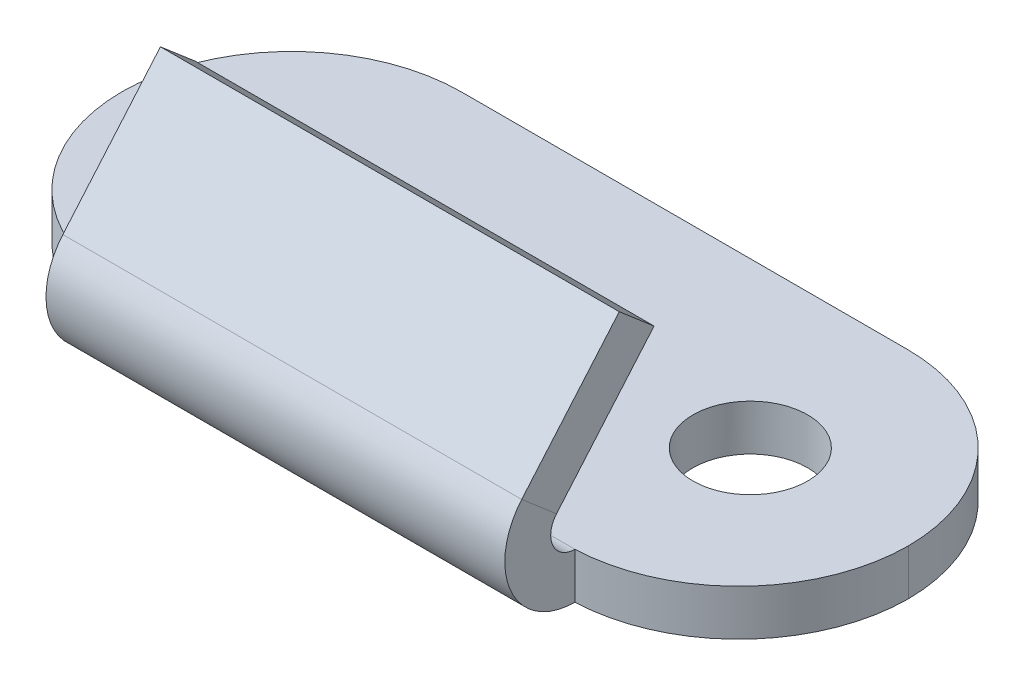
ISO-10303-21;
HEADER;
FILE_DESCRIPTION(('STEP AP214'),'2;1');
FILE_NAME('part.step','',(''),(''),'','','');
FILE_SCHEMA(('AUTOMOTIVE_DESIGN { 1 0 10303 214 1 1 1 1 }'));
ENDSEC;
DATA;
#1=APPLICATION_CONTEXT('core data for automotive mechanical design processes');
#2=APPLICATION_PROTOCOL_DEFINITION('international standard','automotive_design',2000,#1);
#3=PRODUCT_CONTEXT('',#1,'mechanical');
#4=PRODUCT('Part','Part','',(#3));
#5=PRODUCT_RELATED_PRODUCT_CATEGORY('part','',(#4));
#6=PRODUCT_DEFINITION_FORMATION('','',#4);
#7=PRODUCT_DEFINITION_CONTEXT('part definition',#1,'design');
#8=PRODUCT_DEFINITION('design','',#6,#7);
#9=PRODUCT_DEFINITION_SHAPE('','',#8);
#10=(LENGTH_UNIT() NAMED_UNIT(*) SI_UNIT(.MILLI.,.METRE.));
#11=(NAMED_UNIT(*) PLANE_ANGLE_UNIT() SI_UNIT($,.RADIAN.));
#12=(NAMED_UNIT(*) SI_UNIT($,.STERADIAN.) SOLID_ANGLE_UNIT());
#13=UNCERTAINTY_MEASURE_WITH_UNIT(LENGTH_MEASURE(1.E-05),#10,'distance_accuracy_value','');
#14=(GEOMETRIC_REPRESENTATION_CONTEXT(3) GLOBAL_UNCERTAINTY_ASSIGNED_CONTEXT((#13)) GLOBAL_UNIT_ASSIGNED_CONTEXT((#10,
#11,#12)) REPRESENTATION_CONTEXT('',''));
#15=CARTESIAN_POINT('',(0.,0.,0.));
#16=DIRECTION('',(0.,0.,1.));
#17=DIRECTION('',(1.,0.,0.));
#18=AXIS2_PLACEMENT_3D('',#15,#16,#17);
#19=CARTESIAN_POINT('',(12.,-0.911107922838355,13.9370407566886));
#20=DIRECTION('',(0.,0.650791373455968,0.759256602365296));
#21=DIRECTION('',(0.,-0.759256602365297,0.650791373455968));
#22=AXIS2_PLACEMENT_3D('',#19,#20,#21);
#23=PLANE('',#22);
#24=DIRECTION('',(0.,-0.759256602365297,0.650791373455969));
#25=VECTOR('',#24,1.);
#26=CARTESIAN_POINT('',(7.,-0.911107922838355,13.9370407566886));
#27=LINE('',#26,#25);
#28=CARTESIAN_POINT('',(7.,6.08889207716165,7.93704075668858));
#29=VERTEX_POINT('',#28);
#30=CARTESIAN_POINT('',(7.,2.61597292568767,10.9138286008091));
#31=VERTEX_POINT('',#30);
#32=EDGE_CURVE('E187',#29,#31,#27,.T.);
#33=ORIENTED_EDGE('',*,*,#32,.T.);
#34=DIRECTION('',(-1.,0.,0.));
#35=VECTOR('',#34,1.);
#36=CARTESIAN_POINT('',(12.,2.61597292568767,10.9138286008091));
#37=LINE('',#36,#35);
#38=CARTESIAN_POINT('',(-7.,2.61597292568767,10.9138286008091));
#39=VERTEX_POINT('',#38);
#40=EDGE_CURVE('E196',#31,#39,#37,.T.);
#41=ORIENTED_EDGE('',*,*,#40,.T.);
#42=DIRECTION('',(0.,-0.759256602365297,0.650791373455969));
#43=VECTOR('',#42,1.);
#44=CARTESIAN_POINT('',(-7.,-0.911107922838355,13.9370407566886));
#45=LINE('',#44,#43);
#46=CARTESIAN_POINT('',(-7.,6.08889207716165,7.93704075668858));
#47=VERTEX_POINT('',#46);
#48=EDGE_CURVE('E154',#47,#39,#45,.T.);
#49=ORIENTED_EDGE('',*,*,#48,.F.);
#50=DIRECTION('',(-1.,0.,0.));
#51=VECTOR('',#50,1.);
#52=CARTESIAN_POINT('',(12.,6.08889207716165,7.93704075668858));
#53=LINE('',#52,#51);
#54=EDGE_CURVE('E208',#29,#47,#53,.T.);
#55=ORIENTED_EDGE('',*,*,#54,.F.);
#56=EDGE_LOOP('',(#33,#41,#49,#55));
#57=FACE_BOUND('',#56,.T.);
#58=ADVANCED_FACE('F34',(#57),#23,.F.);
#59=CARTESIAN_POINT('',(12.,7.,9.));
#60=DIRECTION('',(0.,0.759256602365296,-0.650791373455968));
#61=DIRECTION('',(0.,0.650791373455968,0.759256602365297));
#62=AXIS2_PLACEMENT_3D('',#59,#60,#61);
#63=PLANE('',#62);
#64=DIRECTION('',(-1.,0.,0.));
#65=VECTOR('',#64,1.);
#66=CARTESIAN_POINT('',(12.,7.,9.));
#67=LINE('',#66,#65);
#68=CARTESIAN_POINT('',(7.,7.,9.));
#69=VERTEX_POINT('',#68);
#70=CARTESIAN_POINT('',(-7.,7.,9.));
#71=VERTEX_POINT('',#70);
#72=EDGE_CURVE('E206',#69,#71,#67,.T.);
#73=ORIENTED_EDGE('',*,*,#72,.F.);
#74=DIRECTION('',(0.,0.650791373455969,0.759256602365297));
#75=VECTOR('',#74,1.);
#76=CARTESIAN_POINT('',(7.,7.,9.));
#77=LINE('',#76,#75);
#78=EDGE_CURVE('E190',#69,#29,#77,.F.);
#79=ORIENTED_EDGE('',*,*,#78,.T.);
#80=ORIENTED_EDGE('',*,*,#54,.T.);
#81=DIRECTION('',(0.,0.650791373455969,0.759256602365297));
#82=VECTOR('',#81,1.);
#83=CARTESIAN_POINT('',(-7.,7.,9.));
#84=LINE('',#83,#82);
#85=EDGE_CURVE('E157',#71,#47,#84,.F.);
#86=ORIENTED_EDGE('',*,*,#85,.F.);
#87=EDGE_LOOP('',(#73,#79,#80,#86));
#88=FACE_BOUND('',#87,.T.);
#89=ADVANCED_FACE('F248',(#88),#63,.T.);
#90=CARTESIAN_POINT('',(12.,0.,15.));
#91=DIRECTION('',(0.,0.650791373455969,0.759256602365297));
#92=DIRECTION('',(0.,-0.759256602365297,0.650791373455969));
#93=AXIS2_PLACEMENT_3D('',#90,#91,#92);
#94=PLANE('',#93);
#95=DIRECTION('',(-1.,0.,0.));
#96=VECTOR('',#95,1.);
#97=CARTESIAN_POINT('',(12.,3.52708084852602,11.9767878441206));
#98=LINE('',#97,#96);
#99=CARTESIAN_POINT('',(7.,3.52708084852602,11.9767878441206));
#100=VERTEX_POINT('',#99);
#101=CARTESIAN_POINT('',(-7.,3.52708084852602,11.9767878441206));
#102=VERTEX_POINT('',#101);
#103=EDGE_CURVE('E123',#100,#102,#98,.T.);
#104=ORIENTED_EDGE('',*,*,#103,.F.);
#105=DIRECTION('',(0.,-0.759256602365297,0.650791373455969));
#106=VECTOR('',#105,1.);
#107=CARTESIAN_POINT('',(7.,0.,15.));
#108=LINE('',#107,#106);
#109=EDGE_CURVE('E185',#69,#100,#108,.T.);
#110=ORIENTED_EDGE('',*,*,#109,.F.);
#111=ORIENTED_EDGE('',*,*,#72,.T.);
#112=DIRECTION('',(0.,-0.759256602365297,0.650791373455969));
#113=VECTOR('',#112,1.);
#114=CARTESIAN_POINT('',(-7.,0.,15.));
#115=LINE('',#114,#113);
#116=EDGE_CURVE('E151',#71,#102,#115,.T.);
#117=ORIENTED_EDGE('',*,*,#116,.T.);
#118=EDGE_LOOP('',(#104,#110,#111,#117));
#119=FACE_BOUND('',#118,.T.);
#120=ADVANCED_FACE('F254',(#119),#94,.T.);
#121=CARTESIAN_POINT('',(12.,2.1366,10.3545601875069));
#122=DIRECTION('',(-1.,0.,0.));
#123=DIRECTION('',(0.,0.,1.));
#124=AXIS2_PLACEMENT_3D('',#121,#122,#123);
#125=CYLINDRICAL_SURFACE('',#124,2.1366);
#126=DIRECTION('',(-1.,0.,0.));
#127=VECTOR('',#126,1.);
#128=CARTESIAN_POINT('',(12.,0.,10.3545601875069));
#129=LINE('',#128,#127);
#130=CARTESIAN_POINT('',(7.,0.,10.3545601875069));
#131=VERTEX_POINT('',#130);
#132=CARTESIAN_POINT('',(-7.,0.,10.3545601875069));
#133=VERTEX_POINT('',#132);
#134=EDGE_CURVE('E108',#131,#133,#129,.T.);
#135=ORIENTED_EDGE('',*,*,#134,.F.);
#136=CARTESIAN_POINT('',(7.,2.1366,10.3545601875069));
#137=DIRECTION('',(-1.,0.,0.));
#138=DIRECTION('',(0.,-1.,0.));
#139=AXIS2_PLACEMENT_3D('',#136,#137,#138);
#140=CIRCLE('',#139,2.1366);
#141=EDGE_CURVE('E181',#100,#131,#140,.F.);
#142=ORIENTED_EDGE('',*,*,#141,.F.);
#143=ORIENTED_EDGE('',*,*,#103,.T.);
#144=CARTESIAN_POINT('',(-7.,2.1366,10.3545601875069));
#145=DIRECTION('',(-1.,0.,0.));
#146=DIRECTION('',(0.,-1.,0.));
#147=AXIS2_PLACEMENT_3D('',#144,#145,#146);
#148=CIRCLE('',#147,2.1366);
#149=EDGE_CURVE('E133',#102,#133,#148,.F.);
#150=ORIENTED_EDGE('',*,*,#149,.T.);
#151=EDGE_LOOP('',(#135,#142,#143,#150));
#152=FACE_BOUND('',#151,.T.);
#153=ADVANCED_FACE('F147',(#152),#125,.T.);
#154=CARTESIAN_POINT('',(12.,2.1366,10.3545601875069));
#155=DIRECTION('',(-1.,0.,0.));
#156=DIRECTION('',(0.,0.,1.));
#157=AXIS2_PLACEMENT_3D('',#154,#155,#156);
#158=CYLINDRICAL_SURFACE('',#157,0.7366);
#159=CARTESIAN_POINT('',(7.,2.1366,10.3545601875069));
#160=DIRECTION('',(-1.,0.,0.));
#161=DIRECTION('',(0.,0.,1.));
#162=AXIS2_PLACEMENT_3D('',#159,#160,#161);
#163=CIRCLE('',#162,0.7366);
#164=CARTESIAN_POINT('',(7.,1.4,10.3545601875069));
#165=VERTEX_POINT('',#164);
#166=EDGE_CURVE('E182',#31,#165,#163,.F.);
#167=ORIENTED_EDGE('',*,*,#166,.T.);
#168=DIRECTION('',(-1.,0.,0.));
#169=VECTOR('',#168,1.);
#170=CARTESIAN_POINT('',(12.,1.4,10.3545601875069));
#171=LINE('',#170,#169);
#172=CARTESIAN_POINT('',(-7.,1.4,10.3545601875069));
#173=VERTEX_POINT('',#172);
#174=EDGE_CURVE('E200',#165,#173,#171,.T.);
#175=ORIENTED_EDGE('',*,*,#174,.T.);
#176=CARTESIAN_POINT('',(-7.,2.1366,10.3545601875069));
#177=DIRECTION('',(-1.,0.,0.));
#178=DIRECTION('',(0.,0.,1.));
#179=AXIS2_PLACEMENT_3D('',#176,#177,#178);
#180=CIRCLE('',#179,0.7366);
#181=EDGE_CURVE('E136',#39,#173,#180,.F.);
#182=ORIENTED_EDGE('',*,*,#181,.F.);
#183=ORIENTED_EDGE('',*,*,#40,.F.);
#184=EDGE_LOOP('',(#167,#175,#182,#183));
#185=FACE_BOUND('',#184,.T.);
#186=ADVANCED_FACE('F227',(#185),#158,.F.);
#187=CARTESIAN_POINT('',(12.,0.,0.));
#188=DIRECTION('',(0.,-1.,0.));
#189=DIRECTION('',(0.,0.,-1.));
#190=AXIS2_PLACEMENT_3D('',#187,#188,#189);
#191=PLANE('',#190);
#192=CARTESIAN_POINT('',(7.,0.,5.));
#193=DIRECTION('',(0.,-1.,0.));
#194=DIRECTION('',(0.,0.,-1.));
#195=AXIS2_PLACEMENT_3D('',#192,#193,#194);
#196=CIRCLE('',#195,1.75);
#197=CARTESIAN_POINT('',(7.,0.,3.25));
#198=VERTEX_POINT('',#197);
#199=EDGE_CURVE('E176',#198,#198,#196,.T.);
#200=ORIENTED_EDGE('',*,*,#199,.F.);
#201=EDGE_LOOP('',(#200));
#202=FACE_BOUND('',#201,.T.);
#203=CARTESIAN_POINT('',(6.8,0.,5.2));
#204=DIRECTION('',(0.,-1.,0.));
#205=DIRECTION('',(0.,0.,-1.));
#206=AXIS2_PLACEMENT_3D('',#203,#204,#205);
#207=CIRCLE('',#206,5.2);
#208=CARTESIAN_POINT('',(6.8,0.,0.));
#209=VERTEX_POINT('',#208);
#210=CARTESIAN_POINT('',(11.9999584153619,0.,5.17920388240011));
#211=VERTEX_POINT('',#210);
#212=EDGE_CURVE('E210',#209,#211,#207,.T.);
#213=ORIENTED_EDGE('',*,*,#212,.T.);
#214=CARTESIAN_POINT('',(6.8,0.,5.15840776480023));
#215=DIRECTION('',(0.,-1.,0.));
#216=DIRECTION('',(0.,0.,-1.));
#217=AXIS2_PLACEMENT_3D('',#214,#215,#216);
#218=CIRCLE('',#217,5.2);
#219=EDGE_CURVE('E117',#211,#131,#218,.T.);
#220=ORIENTED_EDGE('',*,*,#219,.T.);
#221=ORIENTED_EDGE('',*,*,#134,.T.);
#222=CARTESIAN_POINT('',(-6.8,0.,5.15840776480023));
#223=DIRECTION('',(0.,1.,0.));
#224=DIRECTION('',(0.,0.,-1.));
#225=AXIS2_PLACEMENT_3D('',#222,#223,#224);
#226=CIRCLE('',#225,5.2);
#227=CARTESIAN_POINT('',(-11.9999584153619,0.,5.17920388240011));
#228=VERTEX_POINT('',#227);
#229=EDGE_CURVE('E114',#228,#133,#226,.T.);
#230=ORIENTED_EDGE('',*,*,#229,.F.);
#231=CARTESIAN_POINT('',(-6.8,0.,5.2));
#232=DIRECTION('',(0.,1.,0.));
#233=DIRECTION('',(0.,0.,-1.));
#234=AXIS2_PLACEMENT_3D('',#231,#232,#233);
#235=CIRCLE('',#234,5.2);
#236=CARTESIAN_POINT('',(-6.8,0.,0.));
#237=VERTEX_POINT('',#236);
#238=EDGE_CURVE('E145',#237,#228,#235,.T.);
#239=ORIENTED_EDGE('',*,*,#238,.F.);
#240=DIRECTION('',(-1.,0.,0.));
#241=VECTOR('',#240,1.);
#242=CARTESIAN_POINT('',(12.,0.,0.));
#243=LINE('',#242,#241);
#244=EDGE_CURVE('E124',#209,#237,#243,.T.);
#245=ORIENTED_EDGE('',*,*,#244,.F.);
#246=EDGE_LOOP('',(#213,#220,#221,#230,#239,#245));
#247=FACE_BOUND('',#246,.T.);
#248=CARTESIAN_POINT('',(-7.,0.,5.));
#249=DIRECTION('',(0.,1.,0.));
#250=DIRECTION('',(0.,0.,-1.));
#251=AXIS2_PLACEMENT_3D('',#248,#249,#250);
#252=CIRCLE('',#251,1.75);
#253=CARTESIAN_POINT('',(-7.,0.,3.25));
#254=VERTEX_POINT('',#253);
#255=EDGE_CURVE('E140',#254,#254,#252,.T.);
#256=ORIENTED_EDGE('',*,*,#255,.T.);
#257=EDGE_LOOP('',(#256));
#258=FACE_BOUND('',#257,.T.);
#259=ADVANCED_FACE('F110',(#202,#247,#258),#191,.T.);
#260=CARTESIAN_POINT('',(12.,1.4,0.));
#261=DIRECTION('',(0.,0.,-1.));
#262=DIRECTION('',(-1.,0.,0.));
#263=AXIS2_PLACEMENT_3D('',#260,#261,#262);
#264=PLANE('',#263);
#265=DIRECTION('',(-1.,0.,0.));
#266=VECTOR('',#265,1.);
#267=CARTESIAN_POINT('',(12.,1.4,0.));
#268=LINE('',#267,#266);
#269=CARTESIAN_POINT('',(6.8,1.4,0.));
#270=VERTEX_POINT('',#269);
#271=CARTESIAN_POINT('',(-6.8,1.4,0.));
#272=VERTEX_POINT('',#271);
#273=EDGE_CURVE('E202',#270,#272,#268,.T.);
#274=ORIENTED_EDGE('',*,*,#273,.F.);
#275=DIRECTION('',(0.,-1.,0.));
#276=VECTOR('',#275,1.);
#277=CARTESIAN_POINT('',(6.8,1.4,0.));
#278=LINE('',#277,#276);
#279=EDGE_CURVE('E11',#270,#209,#278,.T.);
#280=ORIENTED_EDGE('',*,*,#279,.T.);
#281=ORIENTED_EDGE('',*,*,#244,.T.);
#282=DIRECTION('',(0.,-1.,0.));
#283=VECTOR('',#282,1.);
#284=CARTESIAN_POINT('',(-6.8,1.4,0.));
#285=LINE('',#284,#283);
#286=EDGE_CURVE('E168',#272,#237,#285,.T.);
#287=ORIENTED_EDGE('',*,*,#286,.F.);
#288=EDGE_LOOP('',(#274,#280,#281,#287));
#289=FACE_BOUND('',#288,.T.);
#290=ADVANCED_FACE('F235',(#289),#264,.T.);
#291=CARTESIAN_POINT('',(12.,1.4,0.));
#292=DIRECTION('',(0.,-1.,0.));
#293=DIRECTION('',(0.,0.,-1.));
#294=AXIS2_PLACEMENT_3D('',#291,#292,#293);
#295=PLANE('',#294);
#296=CARTESIAN_POINT('',(7.,1.4,5.));
#297=DIRECTION('',(0.,1.,0.));
#298=DIRECTION('',(0.,0.,1.));
#299=AXIS2_PLACEMENT_3D('',#296,#297,#298);
#300=CIRCLE('',#299,1.75);
#301=CARTESIAN_POINT('',(7.,1.4,6.75));
#302=VERTEX_POINT('',#301);
#303=EDGE_CURVE('E173',#302,#302,#300,.T.);
#304=ORIENTED_EDGE('',*,*,#303,.F.);
#305=EDGE_LOOP('',(#304));
#306=FACE_BOUND('',#305,.T.);
#307=ORIENTED_EDGE('',*,*,#174,.F.);
#308=CARTESIAN_POINT('',(6.8,1.4,5.15840776480023));
#309=DIRECTION('',(0.,-1.,0.));
#310=DIRECTION('',(0.,0.,-1.));
#311=AXIS2_PLACEMENT_3D('',#308,#309,#310);
#312=CIRCLE('',#311,5.2);
#313=CARTESIAN_POINT('',(11.9999584153619,1.4,5.17920388240011));
#314=VERTEX_POINT('',#313);
#315=EDGE_CURVE('E43',#165,#314,#312,.F.);
#316=ORIENTED_EDGE('',*,*,#315,.T.);
#317=CARTESIAN_POINT('',(6.8,1.4,5.2));
#318=DIRECTION('',(0.,-1.,0.));
#319=DIRECTION('',(0.,0.,-1.));
#320=AXIS2_PLACEMENT_3D('',#317,#318,#319);
#321=CIRCLE('',#320,5.2);
#322=EDGE_CURVE('E53',#314,#270,#321,.F.);
#323=ORIENTED_EDGE('',*,*,#322,.T.);
#324=ORIENTED_EDGE('',*,*,#273,.T.);
#325=CARTESIAN_POINT('',(-6.8,1.4,5.2));
#326=DIRECTION('',(0.,1.,0.));
#327=DIRECTION('',(0.,0.,-1.));
#328=AXIS2_PLACEMENT_3D('',#325,#326,#327);
#329=CIRCLE('',#328,5.2);
#330=CARTESIAN_POINT('',(-11.9999584153619,1.4,5.17920388240011));
#331=VERTEX_POINT('',#330);
#332=EDGE_CURVE('E144',#331,#272,#329,.F.);
#333=ORIENTED_EDGE('',*,*,#332,.F.);
#334=CARTESIAN_POINT('',(-6.8,1.4,5.15840776480023));
#335=DIRECTION('',(0.,1.,0.));
#336=DIRECTION('',(0.,0.,-1.));
#337=AXIS2_PLACEMENT_3D('',#334,#335,#336);
#338=CIRCLE('',#337,5.2);
#339=EDGE_CURVE('E166',#173,#331,#338,.F.);
#340=ORIENTED_EDGE('',*,*,#339,.F.);
#341=EDGE_LOOP('',(#307,#316,#323,#324,#333,#340));
#342=FACE_BOUND('',#341,.T.);
#343=CARTESIAN_POINT('',(-7.,1.4,5.));
#344=DIRECTION('',(0.,-1.,0.));
#345=DIRECTION('',(0.,0.,1.));
#346=AXIS2_PLACEMENT_3D('',#343,#344,#345);
#347=CIRCLE('',#346,1.75);
#348=CARTESIAN_POINT('',(-7.,1.4,6.75));
#349=VERTEX_POINT('',#348);
#350=EDGE_CURVE('E172',#349,#349,#347,.T.);
#351=ORIENTED_EDGE('',*,*,#350,.T.);
#352=EDGE_LOOP('',(#351));
#353=FACE_BOUND('',#352,.T.);
#354=ADVANCED_FACE('F228',(#306,#342,#353),#295,.F.);
#355=CARTESIAN_POINT('',(7.,0.,15.));
#356=DIRECTION('',(-1.,0.,0.));
#357=DIRECTION('',(0.,-0.759256602365297,0.650791373455969));
#358=AXIS2_PLACEMENT_3D('',#355,#356,#357);
#359=PLANE('',#358);
#360=ORIENTED_EDGE('',*,*,#109,.T.);
#361=DIRECTION('',(0.,0.650791373455969,0.759256602365297));
#362=VECTOR('',#361,1.);
#363=CARTESIAN_POINT('',(7.,3.52708084852602,11.9767878441206));
#364=LINE('',#363,#362);
#365=EDGE_CURVE('E193',#100,#31,#364,.F.);
#366=ORIENTED_EDGE('',*,*,#365,.T.);
#367=ORIENTED_EDGE('',*,*,#32,.F.);
#368=ORIENTED_EDGE('',*,*,#78,.F.);
#369=EDGE_LOOP('',(#360,#366,#367,#368));
#370=FACE_BOUND('',#369,.T.);
#371=ADVANCED_FACE('F242',(#370),#359,.F.);
#372=CARTESIAN_POINT('',(7.,2.1366,10.3545601875069));
#373=DIRECTION('',(1.,0.,0.));
#374=DIRECTION('',(0.,1.,0.));
#375=AXIS2_PLACEMENT_3D('',#372,#373,#374);
#376=PLANE('',#375);
#377=DIRECTION('',(0.,1.,0.));
#378=VECTOR('',#377,1.);
#379=CARTESIAN_POINT('',(7.,1.4,10.3545601875069));
#380=LINE('',#379,#378);
#381=EDGE_CURVE('E179',#165,#131,#380,.F.);
#382=ORIENTED_EDGE('',*,*,#381,.F.);
#383=ORIENTED_EDGE('',*,*,#166,.F.);
#384=ORIENTED_EDGE('',*,*,#365,.F.);
#385=ORIENTED_EDGE('',*,*,#141,.T.);
#386=EDGE_LOOP('',(#382,#383,#384,#385));
#387=FACE_BOUND('',#386,.T.);
#388=ADVANCED_FACE('F224',(#387),#376,.T.);
#389=CARTESIAN_POINT('',(7.,-8.6,5.));
#390=DIRECTION('',(0.,1.,0.));
#391=DIRECTION('',(0.,0.,1.));
#392=AXIS2_PLACEMENT_3D('',#389,#390,#391);
#393=CYLINDRICAL_SURFACE('',#392,1.75);
#394=ORIENTED_EDGE('',*,*,#199,.T.);
#395=EDGE_LOOP('',(#394));
#396=FACE_BOUND('',#395,.T.);
#397=ORIENTED_EDGE('',*,*,#303,.T.);
#398=EDGE_LOOP('',(#397));
#399=FACE_BOUND('',#398,.T.);
#400=ADVANCED_FACE('F266',(#396,#399),#393,.F.);
#401=CARTESIAN_POINT('',(6.8,1.4,5.2));
#402=DIRECTION('',(0.,-1.,0.));
#403=DIRECTION('',(0.,0.,-1.));
#404=AXIS2_PLACEMENT_3D('',#401,#402,#403);
#405=CYLINDRICAL_SURFACE('',#404,5.2);
#406=ORIENTED_EDGE('',*,*,#279,.F.);
#407=ORIENTED_EDGE('',*,*,#322,.F.);
#408=DIRECTION('',(0.,-1.,0.));
#409=VECTOR('',#408,1.);
#410=CARTESIAN_POINT('',(11.9999584153619,0.700000000000001,5.17920388240011));
#411=LINE('',#410,#409);
#412=EDGE_CURVE('E38',#211,#314,#411,.F.);
#413=ORIENTED_EDGE('',*,*,#412,.F.);
#414=ORIENTED_EDGE('',*,*,#212,.F.);
#415=EDGE_LOOP('',(#406,#407,#413,#414));
#416=FACE_BOUND('',#415,.T.);
#417=ADVANCED_FACE('F36',(#416),#405,.T.);
#418=CARTESIAN_POINT('',(6.8,1.4,5.15840776480023));
#419=DIRECTION('',(0.,1.,0.));
#420=DIRECTION('',(-1.,0.,0.));
#421=AXIS2_PLACEMENT_3D('',#418,#419,#420);
#422=CYLINDRICAL_SURFACE('',#421,5.2);
#423=ORIENTED_EDGE('',*,*,#315,.F.);
#424=ORIENTED_EDGE('',*,*,#381,.T.);
#425=ORIENTED_EDGE('',*,*,#219,.F.);
#426=ORIENTED_EDGE('',*,*,#412,.T.);
#427=EDGE_LOOP('',(#423,#424,#425,#426));
#428=FACE_BOUND('',#427,.T.);
#429=ADVANCED_FACE('F221',(#428),#422,.T.);
#430=CARTESIAN_POINT('',(-7.,0.,15.));
#431=DIRECTION('',(1.,0.,0.));
#432=DIRECTION('',(0.,-0.759256602365297,0.650791373455969));
#433=AXIS2_PLACEMENT_3D('',#430,#431,#432);
#434=PLANE('',#433);
#435=ORIENTED_EDGE('',*,*,#116,.F.);
#436=ORIENTED_EDGE('',*,*,#85,.T.);
#437=ORIENTED_EDGE('',*,*,#48,.T.);
#438=DIRECTION('',(0.,0.650791373455969,0.759256602365297));
#439=VECTOR('',#438,1.);
#440=CARTESIAN_POINT('',(-7.,3.52708084852602,11.9767878441206));
#441=LINE('',#440,#439);
#442=EDGE_CURVE('E159',#102,#39,#441,.F.);
#443=ORIENTED_EDGE('',*,*,#442,.F.);
#444=EDGE_LOOP('',(#435,#436,#437,#443));
#445=FACE_BOUND('',#444,.T.);
#446=ADVANCED_FACE('F259',(#445),#434,.F.);
#447=CARTESIAN_POINT('',(-7.,2.1366,10.3545601875069));
#448=DIRECTION('',(-1.,0.,0.));
#449=DIRECTION('',(0.,1.,0.));
#450=AXIS2_PLACEMENT_3D('',#447,#448,#449);
#451=PLANE('',#450);
#452=DIRECTION('',(0.,1.,0.));
#453=VECTOR('',#452,1.);
#454=CARTESIAN_POINT('',(-7.,1.4,10.3545601875069));
#455=LINE('',#454,#453);
#456=EDGE_CURVE('E130',#173,#133,#455,.F.);
#457=ORIENTED_EDGE('',*,*,#456,.T.);
#458=ORIENTED_EDGE('',*,*,#149,.F.);
#459=ORIENTED_EDGE('',*,*,#442,.T.);
#460=ORIENTED_EDGE('',*,*,#181,.T.);
#461=EDGE_LOOP('',(#457,#458,#459,#460));
#462=FACE_BOUND('',#461,.T.);
#463=ADVANCED_FACE('F131',(#462),#451,.T.);
#464=CARTESIAN_POINT('',(-7.,-8.6,5.));
#465=DIRECTION('',(0.,1.,0.));
#466=DIRECTION('',(0.,0.,1.));
#467=AXIS2_PLACEMENT_3D('',#464,#465,#466);
#468=CYLINDRICAL_SURFACE('',#467,1.75);
#469=ORIENTED_EDGE('',*,*,#255,.F.);
#470=EDGE_LOOP('',(#469));
#471=FACE_BOUND('',#470,.T.);
#472=ORIENTED_EDGE('',*,*,#350,.F.);
#473=EDGE_LOOP('',(#472));
#474=FACE_BOUND('',#473,.T.);
#475=ADVANCED_FACE('F399',(#471,#474),#468,.F.);
#476=CARTESIAN_POINT('',(-6.8,1.4,5.2));
#477=DIRECTION('',(0.,-1.,0.));
#478=DIRECTION('',(0.,0.,-1.));
#479=AXIS2_PLACEMENT_3D('',#476,#477,#478);
#480=CYLINDRICAL_SURFACE('',#479,5.2);
#481=ORIENTED_EDGE('',*,*,#286,.T.);
#482=ORIENTED_EDGE('',*,*,#238,.T.);
#483=DIRECTION('',(0.,-1.,0.));
#484=VECTOR('',#483,1.);
#485=CARTESIAN_POINT('',(-11.9999584153619,0.700000000000001,5.17920388240011));
#486=LINE('',#485,#484);
#487=EDGE_CURVE('E143',#228,#331,#486,.F.);
#488=ORIENTED_EDGE('',*,*,#487,.T.);
#489=ORIENTED_EDGE('',*,*,#332,.T.);
#490=EDGE_LOOP('',(#481,#482,#488,#489));
#491=FACE_BOUND('',#490,.T.);
#492=ADVANCED_FACE('F233',(#491),#480,.T.);
#493=CARTESIAN_POINT('',(-6.8,1.4,5.15840776480023));
#494=DIRECTION('',(0.,1.,0.));
#495=DIRECTION('',(1.,0.,0.));
#496=AXIS2_PLACEMENT_3D('',#493,#494,#495);
#497=CYLINDRICAL_SURFACE('',#496,5.2);
#498=ORIENTED_EDGE('',*,*,#339,.T.);
#499=ORIENTED_EDGE('',*,*,#487,.F.);
#500=ORIENTED_EDGE('',*,*,#229,.T.);
#501=ORIENTED_EDGE('',*,*,#456,.F.);
#502=EDGE_LOOP('',(#498,#499,#500,#501));
#503=FACE_BOUND('',#502,.T.);
#504=ADVANCED_FACE('F142',(#503),#497,.T.);
#505=CLOSED_SHELL('',(#58,#89,#120,#153,#186,#259,#290,#354,#371,#388,#400,#417,#429,#446,#463,
#475,#492,#504));
#506=MANIFOLD_SOLID_BREP('B2',#505);
#507=ADVANCED_BREP_SHAPE_REPRESENTATION('',(#18,#506),#14);
#508=SHAPE_DEFINITION_REPRESENTATION(#9,#507);
ENDSEC;
END-ISO-10303-21;
